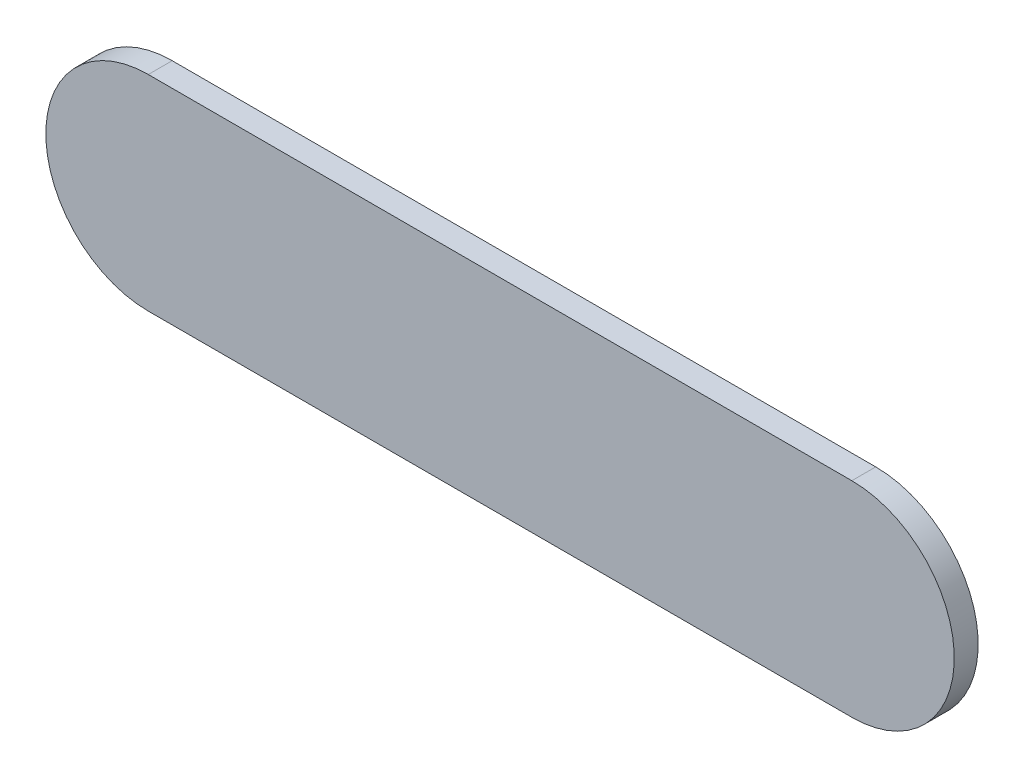
ISO-10303-21;
HEADER;
FILE_DESCRIPTION(('STEP AP214'),'2;1');
FILE_NAME('part.step','',(''),(''),'','','');
FILE_SCHEMA(('AUTOMOTIVE_DESIGN { 1 0 10303 214 1 1 1 1 }'));
ENDSEC;
DATA;
#1=APPLICATION_CONTEXT('core data for automotive mechanical design processes');
#2=APPLICATION_PROTOCOL_DEFINITION('international standard','automotive_design',2000,#1);
#3=PRODUCT_CONTEXT('',#1,'mechanical');
#4=PRODUCT('Part','Part','',(#3));
#5=PRODUCT_RELATED_PRODUCT_CATEGORY('part','',(#4));
#6=PRODUCT_DEFINITION_FORMATION('','',#4);
#7=PRODUCT_DEFINITION_CONTEXT('part definition',#1,'design');
#8=PRODUCT_DEFINITION('design','',#6,#7);
#9=PRODUCT_DEFINITION_SHAPE('','',#8);
#10=(LENGTH_UNIT() NAMED_UNIT(*) SI_UNIT(.MILLI.,.METRE.));
#11=(NAMED_UNIT(*) PLANE_ANGLE_UNIT() SI_UNIT($,.RADIAN.));
#12=(NAMED_UNIT(*) SI_UNIT($,.STERADIAN.) SOLID_ANGLE_UNIT());
#13=UNCERTAINTY_MEASURE_WITH_UNIT(LENGTH_MEASURE(1.E-05),#10,'distance_accuracy_value','');
#14=(GEOMETRIC_REPRESENTATION_CONTEXT(3) GLOBAL_UNCERTAINTY_ASSIGNED_CONTEXT((#13)) GLOBAL_UNIT_ASSIGNED_CONTEXT((#10,
#11,#12)) REPRESENTATION_CONTEXT('',''));
#15=CARTESIAN_POINT('',(0.,0.,0.));
#16=DIRECTION('',(0.,0.,1.));
#17=DIRECTION('',(1.,0.,0.));
#18=AXIS2_PLACEMENT_3D('',#15,#16,#17);
#19=CARTESIAN_POINT('',(130.84,-60.1,1.635));
#20=DIRECTION('',(0.,0.,1.));
#21=DIRECTION('',(1.,0.,0.));
#22=AXIS2_PLACEMENT_3D('',#19,#20,#21);
#23=PLANE('',#22);
#24=DIRECTION('',(1.,0.,0.));
#25=VECTOR('',#24,1.);
#26=CARTESIAN_POINT('',(130.84,-60.1,1.635));
#27=LINE('',#26,#25);
#28=CARTESIAN_POINT('',(130.84,-60.1,1.635));
#29=VERTEX_POINT('',#28);
#30=CARTESIAN_POINT('',(131.87,-60.1,1.635));
#31=VERTEX_POINT('',#30);
#32=EDGE_CURVE('E73',#29,#31,#27,.T.);
#33=ORIENTED_EDGE('',*,*,#32,.T.);
#34=CARTESIAN_POINT('',(131.87,-59.95,1.635));
#35=DIRECTION('',(0.,0.,1.));
#36=DIRECTION('',(0.,-1.,0.));
#37=AXIS2_PLACEMENT_3D('',#34,#35,#36);
#38=CIRCLE('',#37,0.15);
#39=CARTESIAN_POINT('',(131.87,-59.8,1.635));
#40=VERTEX_POINT('',#39);
#41=EDGE_CURVE('E107',#31,#40,#38,.T.);
#42=ORIENTED_EDGE('',*,*,#41,.T.);
#43=DIRECTION('',(-1.,0.,0.));
#44=VECTOR('',#43,1.);
#45=CARTESIAN_POINT('',(131.87,-59.8,1.635));
#46=LINE('',#45,#44);
#47=CARTESIAN_POINT('',(130.84,-59.8,1.635));
#48=VERTEX_POINT('',#47);
#49=EDGE_CURVE('E75',#40,#48,#46,.T.);
#50=ORIENTED_EDGE('',*,*,#49,.T.);
#51=CARTESIAN_POINT('',(130.84,-59.95,1.635));
#52=DIRECTION('',(0.,0.,1.));
#53=DIRECTION('',(1.894780628694E-13,1.,0.));
#54=AXIS2_PLACEMENT_3D('',#51,#52,#53);
#55=CIRCLE('',#54,0.15);
#56=EDGE_CURVE('E11',#48,#29,#55,.T.);
#57=ORIENTED_EDGE('',*,*,#56,.T.);
#58=EDGE_LOOP('',(#33,#42,#50,#57));
#59=FACE_BOUND('',#58,.T.);
#60=ADVANCED_FACE('F17',(#59),#23,.T.);
#61=CARTESIAN_POINT('',(130.84,-60.1,1.6));
#62=DIRECTION('',(0.,0.,1.));
#63=DIRECTION('',(1.,0.,0.));
#64=AXIS2_PLACEMENT_3D('',#61,#62,#63);
#65=PLANE('',#64);
#66=CARTESIAN_POINT('',(130.84,-59.95,1.6));
#67=DIRECTION('',(0.,0.,1.));
#68=DIRECTION('',(1.894780628694E-13,1.,0.));
#69=AXIS2_PLACEMENT_3D('',#66,#67,#68);
#70=CIRCLE('',#69,0.15);
#71=CARTESIAN_POINT('',(130.84,-59.8,1.6));
#72=VERTEX_POINT('',#71);
#73=CARTESIAN_POINT('',(130.84,-60.1,1.6));
#74=VERTEX_POINT('',#73);
#75=EDGE_CURVE('E27',#72,#74,#70,.T.);
#76=ORIENTED_EDGE('',*,*,#75,.F.);
#77=DIRECTION('',(-1.,0.,0.));
#78=VECTOR('',#77,1.);
#79=CARTESIAN_POINT('',(131.87,-59.8,1.6));
#80=LINE('',#79,#78);
#81=CARTESIAN_POINT('',(131.87,-59.8,1.6));
#82=VERTEX_POINT('',#81);
#83=EDGE_CURVE('E108',#82,#72,#80,.T.);
#84=ORIENTED_EDGE('',*,*,#83,.F.);
#85=CARTESIAN_POINT('',(131.87,-59.95,1.6));
#86=DIRECTION('',(0.,0.,1.));
#87=DIRECTION('',(0.,-1.,0.));
#88=AXIS2_PLACEMENT_3D('',#85,#86,#87);
#89=CIRCLE('',#88,0.15);
#90=CARTESIAN_POINT('',(131.87,-60.1,1.6));
#91=VERTEX_POINT('',#90);
#92=EDGE_CURVE('E83',#91,#82,#89,.T.);
#93=ORIENTED_EDGE('',*,*,#92,.F.);
#94=DIRECTION('',(1.,0.,0.));
#95=VECTOR('',#94,1.);
#96=CARTESIAN_POINT('',(130.84,-60.1,1.6));
#97=LINE('',#96,#95);
#98=EDGE_CURVE('E94',#74,#91,#97,.T.);
#99=ORIENTED_EDGE('',*,*,#98,.F.);
#100=EDGE_LOOP('',(#76,#84,#93,#99));
#101=FACE_BOUND('',#100,.T.);
#102=ADVANCED_FACE('F19',(#101),#65,.F.);
#103=CARTESIAN_POINT('',(130.84,-59.95,1.6));
#104=DIRECTION('',(0.,0.,-1.));
#105=DIRECTION('',(1.894780628694E-13,1.,0.));
#106=AXIS2_PLACEMENT_3D('',#103,#104,#105);
#107=CYLINDRICAL_SURFACE('',#106,0.15);
#108=ORIENTED_EDGE('',*,*,#75,.T.);
#109=DIRECTION('',(0.,0.,1.));
#110=VECTOR('',#109,1.);
#111=CARTESIAN_POINT('',(130.84,-60.1,1.6));
#112=LINE('',#111,#110);
#113=EDGE_CURVE('E78',#74,#29,#112,.T.);
#114=ORIENTED_EDGE('',*,*,#113,.T.);
#115=ORIENTED_EDGE('',*,*,#56,.F.);
#116=DIRECTION('',(0.,0.,1.));
#117=VECTOR('',#116,1.);
#118=CARTESIAN_POINT('',(130.84,-59.8,1.6));
#119=LINE('',#118,#117);
#120=EDGE_CURVE('E21',#72,#48,#119,.T.);
#121=ORIENTED_EDGE('',*,*,#120,.F.);
#122=EDGE_LOOP('',(#108,#114,#115,#121));
#123=FACE_BOUND('',#122,.T.);
#124=ADVANCED_FACE('F79',(#123),#107,.T.);
#125=CARTESIAN_POINT('',(131.87,-59.8,1.6));
#126=DIRECTION('',(0.,-1.,0.));
#127=DIRECTION('',(0.,0.,-1.));
#128=AXIS2_PLACEMENT_3D('',#125,#126,#127);
#129=PLANE('',#128);
#130=ORIENTED_EDGE('',*,*,#83,.T.);
#131=ORIENTED_EDGE('',*,*,#120,.T.);
#132=ORIENTED_EDGE('',*,*,#49,.F.);
#133=DIRECTION('',(0.,0.,1.));
#134=VECTOR('',#133,1.);
#135=CARTESIAN_POINT('',(131.87,-59.8,1.6));
#136=LINE('',#135,#134);
#137=EDGE_CURVE('E101',#82,#40,#136,.T.);
#138=ORIENTED_EDGE('',*,*,#137,.F.);
#139=EDGE_LOOP('',(#130,#131,#132,#138));
#140=FACE_BOUND('',#139,.T.);
#141=ADVANCED_FACE('F118',(#140),#129,.F.);
#142=CARTESIAN_POINT('',(131.87,-59.95,1.6));
#143=DIRECTION('',(0.,0.,-1.));
#144=DIRECTION('',(0.,-1.,0.));
#145=AXIS2_PLACEMENT_3D('',#142,#143,#144);
#146=CYLINDRICAL_SURFACE('',#145,0.15);
#147=ORIENTED_EDGE('',*,*,#92,.T.);
#148=ORIENTED_EDGE('',*,*,#137,.T.);
#149=ORIENTED_EDGE('',*,*,#41,.F.);
#150=DIRECTION('',(0.,0.,1.));
#151=VECTOR('',#150,1.);
#152=CARTESIAN_POINT('',(131.87,-60.1,1.6));
#153=LINE('',#152,#151);
#154=EDGE_CURVE('E87',#91,#31,#153,.T.);
#155=ORIENTED_EDGE('',*,*,#154,.F.);
#156=EDGE_LOOP('',(#147,#148,#149,#155));
#157=FACE_BOUND('',#156,.T.);
#158=ADVANCED_FACE('F116',(#157),#146,.T.);
#159=CARTESIAN_POINT('',(130.84,-60.1,1.6));
#160=DIRECTION('',(0.,1.,0.));
#161=DIRECTION('',(1.,0.,0.));
#162=AXIS2_PLACEMENT_3D('',#159,#160,#161);
#163=PLANE('',#162);
#164=ORIENTED_EDGE('',*,*,#98,.T.);
#165=ORIENTED_EDGE('',*,*,#154,.T.);
#166=ORIENTED_EDGE('',*,*,#32,.F.);
#167=ORIENTED_EDGE('',*,*,#113,.F.);
#168=EDGE_LOOP('',(#164,#165,#166,#167));
#169=FACE_BOUND('',#168,.T.);
#170=ADVANCED_FACE('F85',(#169),#163,.F.);
#171=CLOSED_SHELL('',(#60,#102,#124,#141,#158,#170));
#172=MANIFOLD_SOLID_BREP('B1',#171);
#173=ADVANCED_BREP_SHAPE_REPRESENTATION('',(#18,#172),#14);
#174=SHAPE_DEFINITION_REPRESENTATION(#9,#173);
ENDSEC;
END-ISO-10303-21;
